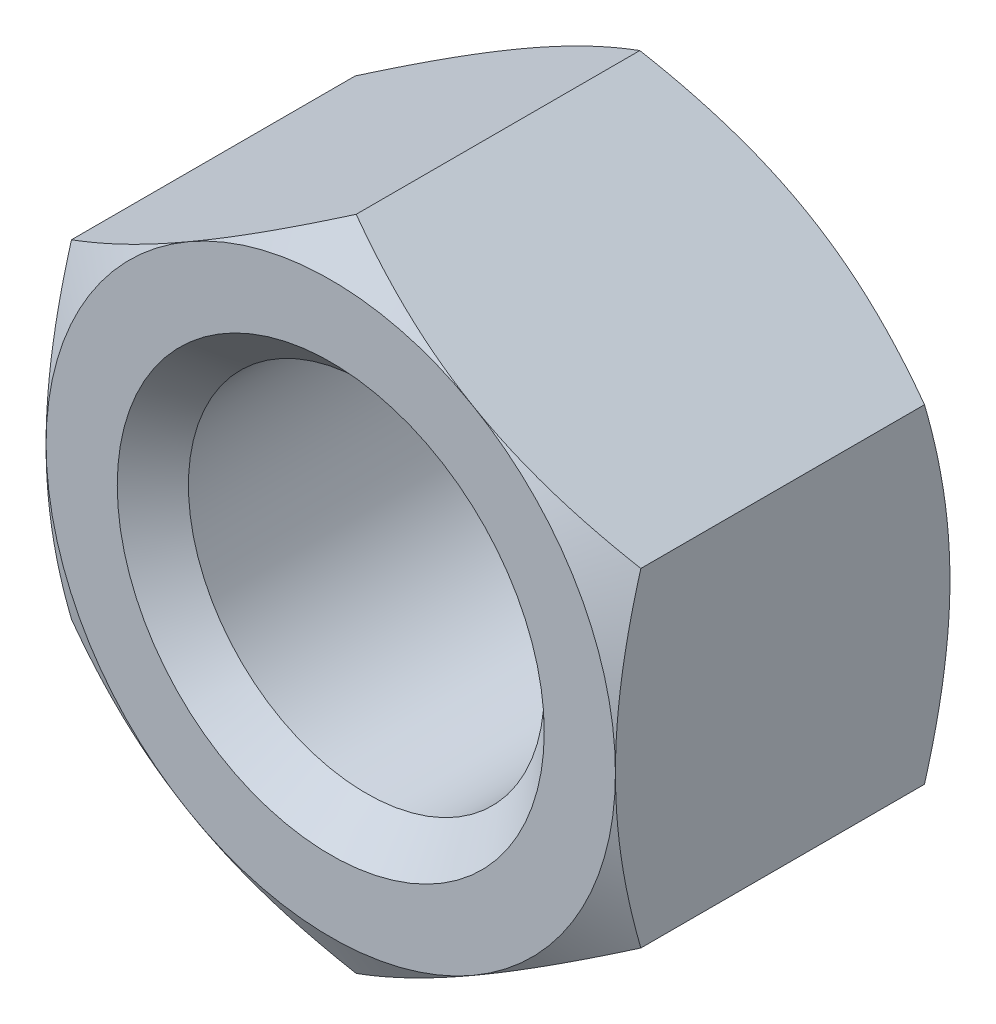
ISO-10303-21;
HEADER;
FILE_DESCRIPTION(('STEP AP214'),'2;1');
FILE_NAME('part.step','',(''),(''),'','','');
FILE_SCHEMA(('AUTOMOTIVE_DESIGN { 1 0 10303 214 1 1 1 1 }'));
ENDSEC;
DATA;
#1=APPLICATION_CONTEXT('core data for automotive mechanical design processes');
#2=APPLICATION_PROTOCOL_DEFINITION('international standard','automotive_design',2000,#1);
#3=PRODUCT_CONTEXT('',#1,'mechanical');
#4=PRODUCT('Part','Part','',(#3));
#5=PRODUCT_RELATED_PRODUCT_CATEGORY('part','',(#4));
#6=PRODUCT_DEFINITION_FORMATION('','',#4);
#7=PRODUCT_DEFINITION_CONTEXT('part definition',#1,'design');
#8=PRODUCT_DEFINITION('design','',#6,#7);
#9=PRODUCT_DEFINITION_SHAPE('','',#8);
#10=(LENGTH_UNIT() NAMED_UNIT(*) SI_UNIT(.MILLI.,.METRE.));
#11=(NAMED_UNIT(*) PLANE_ANGLE_UNIT() SI_UNIT($,.RADIAN.));
#12=(NAMED_UNIT(*) SI_UNIT($,.STERADIAN.) SOLID_ANGLE_UNIT());
#13=UNCERTAINTY_MEASURE_WITH_UNIT(LENGTH_MEASURE(1.E-05),#10,'distance_accuracy_value','');
#14=(GEOMETRIC_REPRESENTATION_CONTEXT(3) GLOBAL_UNCERTAINTY_ASSIGNED_CONTEXT((#13)) GLOBAL_UNIT_ASSIGNED_CONTEXT((#10,
#11,#12)) REPRESENTATION_CONTEXT('',''));
#15=CARTESIAN_POINT('',(0.,0.,0.));
#16=DIRECTION('',(0.,0.,1.));
#17=DIRECTION('',(1.,0.,0.));
#18=AXIS2_PLACEMENT_3D('',#15,#16,#17);
#19=CARTESIAN_POINT('',(0.,0.,4.7));
#20=DIRECTION('',(0.,0.,-1.));
#21=DIRECTION('',(-1.,0.,0.));
#22=AXIS2_PLACEMENT_3D('',#19,#20,#21);
#23=CONICAL_SURFACE('',#22,3.99999999999999,1.0471975511966);
#24=CARTESIAN_POINT('',(-0.0002,4.61891762357084,4.34266774092523));
#25=CARTESIAN_POINT('',(0.175579150323228,4.5174314838138,4.40128212635172));
#26=CARTESIAN_POINT('',(0.35287561632638,4.41506932144051,4.45458967853773));
#27=CARTESIAN_POINT('',(0.710538593175706,4.20857250547739,4.54763832925359));
#28=CARTESIAN_POINT('',(0.89091145897015,4.10443418285647,4.58734651097029));
#29=CARTESIAN_POINT('',(1.24942181870279,3.89744813015756,4.64915778471972));
#30=CARTESIAN_POINT('',(1.42750415293514,3.79463224655059,4.67167226847711));
#31=CARTESIAN_POINT('',(1.78450671716651,3.58851671999023,4.69854937685342));
#32=CARTESIAN_POINT('',(1.9634256496441,3.48521782616117,4.70293425857305));
#33=CARTESIAN_POINT('',(2.29774284219673,3.29219970504619,4.69380992706003));
#34=CARTESIAN_POINT('',(2.45319115998706,3.20245157692486,4.682541046012));
#35=CARTESIAN_POINT('',(2.76307505563505,3.02354002635497,4.6468260092018));
#36=CARTESIAN_POINT('',(2.91750956174413,2.93437722268072,4.62236765428846));
#37=CARTESIAN_POINT('',(3.22803232777458,2.75509682012354,4.56122393508071));
#38=CARTESIAN_POINT('',(3.3840812880631,2.6650019108942,4.52427939634514));
#39=CARTESIAN_POINT('',(3.69385183540384,2.48615580200001,4.44042992745197));
#40=CARTESIAN_POINT('',(3.84757739077378,2.39740231122585,4.39354469778726));
#41=CARTESIAN_POINT('',(4.0002,2.30928560670467,4.34266774092523));
#42=B_SPLINE_CURVE_WITH_KNOTS('',3,(#24,#25,#26,#27,#28,#29,#30,#31,#32,#33,#34,#35,#36,#37,#38,
#39,#40,#41),.UNSPECIFIED.,.F.,.F.,(4,2,2,2,2,2,2,2,4),(0.,0.634047835695965,1.26961969224543,
1.88946157213122,2.50854226669297,3.04757825393385,3.58711366126903,4.13861653143763,
4.68903648037743),.UNSPECIFIED.);
#43=CARTESIAN_POINT('',(0.,4.618802153517,4.34273441009184));
#44=VERTEX_POINT('',#43);
#45=CARTESIAN_POINT('',(2.,3.46410161513775,4.7));
#46=VERTEX_POINT('',#45);
#47=EDGE_CURVE('E293',#44,#46,#42,.T.);
#48=ORIENTED_EDGE('',*,*,#47,.F.);
#49=CARTESIAN_POINT('',(-4.0002,2.30928560670466,4.34266774092523));
#50=CARTESIAN_POINT('',(-3.82442084967677,2.4107717464617,4.40128212635172));
#51=CARTESIAN_POINT('',(-3.64712438367362,2.51313390883499,4.45458967853774));
#52=CARTESIAN_POINT('',(-3.28946140682429,2.71963072479811,4.54763832925359));
#53=CARTESIAN_POINT('',(-3.10908854102985,2.82376904741904,4.58734651097029));
#54=CARTESIAN_POINT('',(-2.75057818129721,3.03075510011795,4.64915778471972));
#55=CARTESIAN_POINT('',(-2.57249584706486,3.13357098372492,4.67167226847711));
#56=CARTESIAN_POINT('',(-2.21549328283349,3.33968651028528,4.69854937685342));
#57=CARTESIAN_POINT('',(-2.0365743503559,3.44298540411434,4.70293425857305));
#58=CARTESIAN_POINT('',(-1.70225715780327,3.63600352522932,4.69380992706003));
#59=CARTESIAN_POINT('',(-1.54680884001293,3.72575165335064,4.682541046012));
#60=CARTESIAN_POINT('',(-1.23692494436494,3.90466320392054,4.6468260092018));
#61=CARTESIAN_POINT('',(-1.08249043825587,3.99382600759478,4.62236765428847));
#62=CARTESIAN_POINT('',(-0.771967672225422,4.17310641015197,4.56122393508071));
#63=CARTESIAN_POINT('',(-0.615918711936897,4.26320131938131,4.52427939634514));
#64=CARTESIAN_POINT('',(-0.306148164596161,4.4420474282755,4.44042992745197));
#65=CARTESIAN_POINT('',(-0.152422609226221,4.53080091904966,4.39354469778726));
#66=CARTESIAN_POINT('',(0.000199999999999767,4.61891762357084,4.34266774092523));
#67=B_SPLINE_CURVE_WITH_KNOTS('',3,(#49,#50,#51,#52,#53,#54,#55,#56,#57,#58,#59,#60,#61,#62,#63,
#64,#65,#66),.UNSPECIFIED.,.F.,.F.,(4,2,2,2,2,2,2,2,4),(0.,0.634047835695965,1.26961969224543,
1.88946157213122,2.50854226669297,3.04757825393386,3.58711366126903,4.13861653143764,
4.68903648037743),.UNSPECIFIED.);
#68=CARTESIAN_POINT('',(-1.99999999999999,3.46410161513775,4.7));
#69=VERTEX_POINT('',#68);
#70=EDGE_CURVE('E187',#69,#44,#67,.T.);
#71=ORIENTED_EDGE('',*,*,#70,.F.);
#72=CARTESIAN_POINT('',(0.,0.,4.7));
#73=DIRECTION('',(0.,0.,1.));
#74=DIRECTION('',(1.,0.,0.));
#75=AXIS2_PLACEMENT_3D('',#72,#73,#74);
#76=CIRCLE('',#75,3.99999999999999);
#77=EDGE_CURVE('E296',#46,#69,#76,.T.);
#78=ORIENTED_EDGE('',*,*,#77,.F.);
#79=EDGE_LOOP('',(#48,#71,#78));
#80=FACE_BOUND('',#79,.T.);
#81=ADVANCED_FACE('F36',(#80),#23,.T.);
#82=CARTESIAN_POINT('',(4.,2.3094010767585,4.34273441009184));
#83=VERTEX_POINT('',#82);
#84=EDGE_CURVE('E230',#46,#83,#42,.T.);
#85=ORIENTED_EDGE('',*,*,#84,.F.);
#86=CARTESIAN_POINT('',(4.,0.,4.7));
#87=VERTEX_POINT('',#86);
#88=EDGE_CURVE('E152',#87,#46,#76,.T.);
#89=ORIENTED_EDGE('',*,*,#88,.F.);
#90=CARTESIAN_POINT('',(4.,-6.15545088747085,2.77110048854843));
#91=CARTESIAN_POINT('',(4.00000000000001,-5.98114186087783,2.85546231457587));
#92=CARTESIAN_POINT('',(4.,-5.80642751098609,2.93900126713936));
#93=CARTESIAN_POINT('',(4.,-5.45597243215449,3.10396963566688));
#94=CARTESIAN_POINT('',(4.,-5.28023154228886,3.18539870937307));
#95=CARTESIAN_POINT('',(4.,-4.9265789566514,3.34610351830733));
#96=CARTESIAN_POINT('',(4.,-4.74866061873608,3.42536468804252));
#97=CARTESIAN_POINT('',(4.,-4.39139197498405,3.5805787660156));
#98=CARTESIAN_POINT('',(4.,-4.21204173874208,3.65653183389324));
#99=CARTESIAN_POINT('',(4.,-3.84601982400982,3.80655169702362));
#100=CARTESIAN_POINT('',(4.,-3.65929378443006,3.8804865972198));
#101=CARTESIAN_POINT('',(4.,-3.2836394607088,4.02264382856622));
#102=CARTESIAN_POINT('',(4.,-3.09471092960005,4.09086551193142));
#103=CARTESIAN_POINT('',(4.,-2.71472052884562,4.21977015945126));
#104=CARTESIAN_POINT('',(4.,-2.52366403524861,4.28046880957509));
#105=CARTESIAN_POINT('',(4.,-2.13881115865353,4.39234809270445));
#106=CARTESIAN_POINT('',(4.,-1.94501567492137,4.44353177498659));
#107=CARTESIAN_POINT('',(4.,-1.55564287611942,4.53362352782791));
#108=CARTESIAN_POINT('',(4.,-1.36008084750245,4.57259643497073));
#109=CARTESIAN_POINT('',(4.,-0.966575851508147,4.63603138466969));
#110=CARTESIAN_POINT('',(4.,-0.768633095505255,4.6604947059061));
#111=CARTESIAN_POINT('',(4.,-0.373920044043125,4.69263778597106));
#112=CARTESIAN_POINT('',(4.,-0.177167442071596,4.7005294825183));
#113=CARTESIAN_POINT('',(4.,0.216304224954209,4.69941524775345));
#114=CARTESIAN_POINT('',(4.,0.413023289047261,4.69040889406233));
#115=CARTESIAN_POINT('',(4.,0.748437665028927,4.66127642659607));
#116=CARTESIAN_POINT('',(4.,0.887496552647106,4.64510883728164));
#117=CARTESIAN_POINT('',(4.,1.16455854560109,4.60536271634653));
#118=CARTESIAN_POINT('',(4.,1.30256149864476,4.58178313562572));
#119=CARTESIAN_POINT('',(4.,1.71482433029255,4.50116982292969));
#120=CARTESIAN_POINT('',(4.,1.98717590850952,4.43427744783848));
#121=CARTESIAN_POINT('',(4.,2.39434499914105,4.31876886880047));
#122=CARTESIAN_POINT('',(4.,2.53128526457542,4.27721333939712));
#123=CARTESIAN_POINT('',(4.,2.80383477839475,4.18990721083544));
#124=CARTESIAN_POINT('',(4.,2.9394440182531,4.14415658482255));
#125=CARTESIAN_POINT('',(4.,3.20937675661789,4.04918430191997));
#126=CARTESIAN_POINT('',(4.,3.34370069023235,3.99996387052887));
#127=CARTESIAN_POINT('',(4.,3.61124396151916,3.89861892121983));
#128=CARTESIAN_POINT('',(4.,3.74446330977272,3.84649443115788));
#129=CARTESIAN_POINT('',(4.,4.04870128818048,3.7242426028733));
#130=CARTESIAN_POINT('',(4.,4.21939338858742,3.65330436320314));
#131=CARTESIAN_POINT('',(4.,4.55940655095512,3.50820657634858));
#132=CARTESIAN_POINT('',(4.,4.72872754365851,3.43404686763082));
#133=CARTESIAN_POINT('',(4.,5.06623845002946,3.28312627237672));
#134=CARTESIAN_POINT('',(4.,5.23442816383921,3.20636493997549));
#135=CARTESIAN_POINT('',(4.,5.5698315542117,3.0507357665636));
#136=CARTESIAN_POINT('',(4.,5.73704521206639,2.97186788533723));
#137=CARTESIAN_POINT('',(4.,6.23775058722222,2.73255382234829));
#138=CARTESIAN_POINT('',(3.99999999999999,6.570010429471,2.56953141935787));
#139=CARTESIAN_POINT('',(3.99999999999999,7.23217091234607,2.23876568472744));
#140=CARTESIAN_POINT('',(3.99999999999999,7.56207147273066,2.07102219346682));
#141=CARTESIAN_POINT('',(3.99999999999999,8.19416831375056,1.74550981190927));
#142=CARTESIAN_POINT('',(3.99999999999999,8.49649716945776,1.58799788792128));
#143=CARTESIAN_POINT('',(3.99999999999999,9.10001953886559,1.27079530104014));
#144=CARTESIAN_POINT('',(3.99999999999999,9.4012130180079,1.11110457250164));
#145=CARTESIAN_POINT('',(3.99999999999999,10.0020291462337,0.790412315732012));
#146=CARTESIAN_POINT('',(3.99999999999999,10.3016538052005,0.629414548139541));
#147=CARTESIAN_POINT('',(3.99999999999999,10.9001707440637,0.306098465029867));
#148=CARTESIAN_POINT('',(3.99999999999999,11.1990630598532,0.143780215987023));
#149=CARTESIAN_POINT('',(3.99999999999999,11.4976828427579,-0.0190342814286935));
#150=B_SPLINE_CURVE_WITH_KNOTS('',3,(#90,#91,#92,#93,#94,#95,#96,#97,#98,#99,#100,#101,#102,
#103,#104,#105,#106,#107,#108,#109,#110,#111,#112,#113,#114,#115,#116,#117,#118,#119,#120,#121,
#122,#123,#124,#125,#126,#127,#128,#129,#130,#131,#132,#133,#134,#135,#136,#137,#138,#139,#140,
#141,#142,#143,#144,#145,#146,#147,#148,#149),.UNSPECIFIED.,.F.,.F.,(4,2,2,2,2,2,2,2,2,2,2,2,2,
2,2,2,2,2,2,2,2,2,2,2,2,2,2,2,2,4),(0.,0.580959133680623,1.16201192606087,1.74630973579809,
2.33057931764387,2.93299929486134,3.53548748440098,4.13669752633278,4.73771456413903,
5.33548401831462,5.93320078527869,6.52322548140264,7.11326492581866,7.5330470873157,
7.95288869194371,8.79305885268669,9.22234391725191,9.6516317300421,10.0807686752929,
10.5099015049321,11.0643958704508,11.6189180720164,12.1735357926845,12.7281641090279,
13.8383962827311,14.9486660387318,15.9713541002379,16.9940730427236,18.0144894037644,
19.0348547100405),.UNSPECIFIED.);
#151=EDGE_CURVE('E228',#83,#87,#150,.F.);
#152=ORIENTED_EDGE('',*,*,#151,.F.);
#153=EDGE_LOOP('',(#85,#89,#152));
#154=FACE_BOUND('',#153,.T.);
#155=ADVANCED_FACE('F284',(#154),#23,.T.);
#156=CARTESIAN_POINT('',(4.,-2.30940107675851,4.34273441009183));
#157=VERTEX_POINT('',#156);
#158=EDGE_CURVE('E223',#87,#157,#150,.F.);
#159=ORIENTED_EDGE('',*,*,#158,.F.);
#160=CARTESIAN_POINT('',(2.,-3.46410161513776,4.7));
#161=VERTEX_POINT('',#160);
#162=EDGE_CURVE('E299',#161,#87,#76,.T.);
#163=ORIENTED_EDGE('',*,*,#162,.F.);
#164=CARTESIAN_POINT('',(4.0002,-2.30928560670467,4.34266774092523));
#165=CARTESIAN_POINT('',(3.82442084967677,-2.41077174646171,4.40128212635171));
#166=CARTESIAN_POINT('',(3.64712438367362,-2.513133908835,4.45458967853773));
#167=CARTESIAN_POINT('',(3.28946140682429,-2.71963072479812,4.54763832925359));
#168=CARTESIAN_POINT('',(3.10908854102985,-2.82376904741905,4.58734651097029));
#169=CARTESIAN_POINT('',(2.75057818129721,-3.03075510011796,4.64915778471971));
#170=CARTESIAN_POINT('',(2.57249584706486,-3.13357098372492,4.6716722684771));
#171=CARTESIAN_POINT('',(2.21549328283349,-3.33968651028529,4.69854937685341));
#172=CARTESIAN_POINT('',(2.0365743503559,-3.44298540411435,4.70293425857305));
#173=CARTESIAN_POINT('',(1.70225715780327,-3.63600352522933,4.69380992706002));
#174=CARTESIAN_POINT('',(1.54680884001293,-3.72575165335065,4.682541046012));
#175=CARTESIAN_POINT('',(1.23692494436495,-3.90466320392055,4.6468260092018));
#176=CARTESIAN_POINT('',(1.08249043825587,-3.99382600759479,4.62236765428846));
#177=CARTESIAN_POINT('',(0.771967672225423,-4.17310641015198,4.5612239350807));
#178=CARTESIAN_POINT('',(0.615918711936899,-4.26320131938132,4.52427939634513));
#179=CARTESIAN_POINT('',(0.306148164596162,-4.44204742827551,4.44042992745197));
#180=CARTESIAN_POINT('',(0.152422609226222,-4.53080091904967,4.39354469778725));
#181=CARTESIAN_POINT('',(-0.000199999999998162,-4.61891762357085,4.34266774092523));
#182=B_SPLINE_CURVE_WITH_KNOTS('',3,(#164,#165,#166,#167,#168,#169,#170,#171,#172,#173,#174,
#175,#176,#177,#178,#179,#180,#181),.UNSPECIFIED.,.F.,.F.,(4,2,2,2,2,2,2,2,4),(0.,
0.634047835695966,1.26961969224543,1.88946157213122,2.50854226669297,3.04757825393386,
3.58711366126903,4.13861653143764,4.68903648037743),.UNSPECIFIED.);
#183=EDGE_CURVE('E229',#157,#161,#182,.T.);
#184=ORIENTED_EDGE('',*,*,#183,.F.);
#185=EDGE_LOOP('',(#159,#163,#184));
#186=FACE_BOUND('',#185,.T.);
#187=ADVANCED_FACE('F289',(#186),#23,.T.);
#188=CARTESIAN_POINT('',(0.,-4.61880215351701,4.34273441009183));
#189=VERTEX_POINT('',#188);
#190=EDGE_CURVE('E217',#161,#189,#182,.T.);
#191=ORIENTED_EDGE('',*,*,#190,.F.);
#192=CARTESIAN_POINT('',(-2.,-3.46410161513776,4.7));
#193=VERTEX_POINT('',#192);
#194=EDGE_CURVE('E301',#193,#161,#76,.T.);
#195=ORIENTED_EDGE('',*,*,#194,.F.);
#196=CARTESIAN_POINT('',(0.000200000000001616,-4.61891762357085,4.34266774092523));
#197=CARTESIAN_POINT('',(-0.175579150323227,-4.51743148381381,4.40128212635171));
#198=CARTESIAN_POINT('',(-0.35287561632638,-4.41506932144052,4.45458967853773));
#199=CARTESIAN_POINT('',(-0.710538593175706,-4.2085725054774,4.54763832925359));
#200=CARTESIAN_POINT('',(-0.890911458970151,-4.10443418285647,4.58734651097029));
#201=CARTESIAN_POINT('',(-1.24942181870279,-3.89744813015757,4.64915778471971));
#202=CARTESIAN_POINT('',(-1.42750415293514,-3.7946322465506,4.6716722684771));
#203=CARTESIAN_POINT('',(-1.78450671716651,-3.58851671999023,4.69854937685341));
#204=CARTESIAN_POINT('',(-1.9634256496441,-3.48521782616117,4.70293425857305));
#205=CARTESIAN_POINT('',(-2.29774284219673,-3.29219970504619,4.69380992706002));
#206=CARTESIAN_POINT('',(-2.45319115998707,-3.20245157692487,4.682541046012));
#207=CARTESIAN_POINT('',(-2.76307505563506,-3.02354002635497,4.6468260092018));
#208=CARTESIAN_POINT('',(-2.91750956174413,-2.93437722268073,4.62236765428846));
#209=CARTESIAN_POINT('',(-3.22803232777458,-2.75509682012355,4.56122393508071));
#210=CARTESIAN_POINT('',(-3.3840812880631,-2.6650019108942,4.52427939634513));
#211=CARTESIAN_POINT('',(-3.69385183540384,-2.48615580200001,4.44042992745197));
#212=CARTESIAN_POINT('',(-3.84757739077378,-2.39740231122585,4.39354469778726));
#213=CARTESIAN_POINT('',(-4.0002,-2.30928560670467,4.34266774092523));
#214=B_SPLINE_CURVE_WITH_KNOTS('',3,(#196,#197,#198,#199,#200,#201,#202,#203,#204,#205,#206,
#207,#208,#209,#210,#211,#212,#213),.UNSPECIFIED.,.F.,.F.,(4,2,2,2,2,2,2,2,4),(0.,
0.634047835695967,1.26961969224544,1.88946157213122,2.50854226669297,3.04757825393386,
3.58711366126904,4.13861653143764,4.68903648037743),.UNSPECIFIED.);
#215=EDGE_CURVE('E325',#189,#193,#214,.T.);
#216=ORIENTED_EDGE('',*,*,#215,.F.);
#217=EDGE_LOOP('',(#191,#195,#216));
#218=FACE_BOUND('',#217,.T.);
#219=ADVANCED_FACE('F329',(#218),#23,.T.);
#220=CARTESIAN_POINT('',(-4.,-2.30940107675851,4.34273441009183));
#221=VERTEX_POINT('',#220);
#222=EDGE_CURVE('E212',#193,#221,#214,.T.);
#223=ORIENTED_EDGE('',*,*,#222,.F.);
#224=CARTESIAN_POINT('',(-4.,0.,4.7));
#225=VERTEX_POINT('',#224);
#226=EDGE_CURVE('E316',#225,#193,#76,.T.);
#227=ORIENTED_EDGE('',*,*,#226,.F.);
#228=CARTESIAN_POINT('',(-4.,-6.15545088747085,2.77110048854844));
#229=CARTESIAN_POINT('',(-4.,-5.98114186087783,2.85546231457588));
#230=CARTESIAN_POINT('',(-4.,-5.80642751098609,2.93900126713936));
#231=CARTESIAN_POINT('',(-4.,-5.45597243215449,3.10396963566688));
#232=CARTESIAN_POINT('',(-4.,-5.28023154228886,3.18539870937307));
#233=CARTESIAN_POINT('',(-4.,-4.9265789566514,3.34610351830733));
#234=CARTESIAN_POINT('',(-4.,-4.74866061873608,3.42536468804253));
#235=CARTESIAN_POINT('',(-4.,-4.39139197498404,3.58057876601561));
#236=CARTESIAN_POINT('',(-4.,-4.21204173874208,3.65653183389324));
#237=CARTESIAN_POINT('',(-4.,-3.84601982400981,3.80655169702363));
#238=CARTESIAN_POINT('',(-4.,-3.65929378443006,3.8804865972198));
#239=CARTESIAN_POINT('',(-4.,-3.28363946070879,4.02264382856622));
#240=CARTESIAN_POINT('',(-4.,-3.09471092960005,4.09086551193142));
#241=CARTESIAN_POINT('',(-4.,-2.71472052884562,4.21977015945126));
#242=CARTESIAN_POINT('',(-4.,-2.52366403524861,4.28046880957509));
#243=CARTESIAN_POINT('',(-4.,-2.13881115865353,4.39234809270445));
#244=CARTESIAN_POINT('',(-4.,-1.94501567492137,4.44353177498659));
#245=CARTESIAN_POINT('',(-4.,-1.55564287611941,4.53362352782791));
#246=CARTESIAN_POINT('',(-4.,-1.36008084750244,4.57259643497073));
#247=CARTESIAN_POINT('',(-4.,-0.966575851508145,4.63603138466969));
#248=CARTESIAN_POINT('',(-4.,-0.768633095505253,4.6604947059061));
#249=CARTESIAN_POINT('',(-4.,-0.373920044043123,4.69263778597106));
#250=CARTESIAN_POINT('',(-4.,-0.177167442071594,4.7005294825183));
#251=CARTESIAN_POINT('',(-4.,0.216304224954209,4.69941524775345));
#252=CARTESIAN_POINT('',(-4.,0.413023289047261,4.69040889406233));
#253=CARTESIAN_POINT('',(-4.,0.748437665028928,4.66127642659607));
#254=CARTESIAN_POINT('',(-4.,0.887496552647107,4.64510883728164));
#255=CARTESIAN_POINT('',(-4.,1.16455854560109,4.60536271634653));
#256=CARTESIAN_POINT('',(-4.,1.30256149864477,4.58178313562572));
#257=CARTESIAN_POINT('',(-4.,1.71482433029255,4.50116982292968));
#258=CARTESIAN_POINT('',(-4.,1.98717590850953,4.43427744783848));
#259=CARTESIAN_POINT('',(-4.,2.39434499914105,4.31876886880046));
#260=CARTESIAN_POINT('',(-4.,2.53128526457542,4.27721333939712));
#261=CARTESIAN_POINT('',(-4.,2.80383477839475,4.18990721083544));
#262=CARTESIAN_POINT('',(-4.,2.93944401825311,4.14415658482255));
#263=CARTESIAN_POINT('',(-4.,3.20937675661789,4.04918430191997));
#264=CARTESIAN_POINT('',(-4.,3.34370069023235,3.99996387052887));
#265=CARTESIAN_POINT('',(-4.,3.61124396151917,3.89861892121982));
#266=CARTESIAN_POINT('',(-4.,3.74446330977272,3.84649443115787));
#267=CARTESIAN_POINT('',(-4.,4.04870128818048,3.7242426028733));
#268=CARTESIAN_POINT('',(-4.,4.21939338858743,3.65330436320314));
#269=CARTESIAN_POINT('',(-4.,4.55940655095512,3.50820657634858));
#270=CARTESIAN_POINT('',(-4.,4.72872754365851,3.43404686763082));
#271=CARTESIAN_POINT('',(-4.,5.06623845002947,3.28312627237671));
#272=CARTESIAN_POINT('',(-4.,5.23442816383922,3.20636493997548));
#273=CARTESIAN_POINT('',(-4.,5.56983155421171,3.05073576656359));
#274=CARTESIAN_POINT('',(-4.,5.73704521206639,2.97186788533723));
#275=CARTESIAN_POINT('',(-4.,6.23775058722222,2.73255382234828));
#276=CARTESIAN_POINT('',(-4.,6.570010429471,2.56953141935786));
#277=CARTESIAN_POINT('',(-4.,7.23217091234607,2.23876568472744));
#278=CARTESIAN_POINT('',(-4.,7.56207147273066,2.07102219346681));
#279=CARTESIAN_POINT('',(-4.,8.19416831375056,1.74550981190926));
#280=CARTESIAN_POINT('',(-4.,8.49649716945776,1.58799788792127));
#281=CARTESIAN_POINT('',(-4.,9.10001953886559,1.27079530104014));
#282=CARTESIAN_POINT('',(-4.,9.4012130180079,1.11110457250164));
#283=CARTESIAN_POINT('',(-4.,10.0020291462337,0.79041231573201));
#284=CARTESIAN_POINT('',(-4.,10.3016538052005,0.629414548139539));
#285=CARTESIAN_POINT('',(-4.,10.9001707440637,0.306098465029865));
#286=CARTESIAN_POINT('',(-4.,11.1990630598532,0.143780215987021));
#287=CARTESIAN_POINT('',(-4.,11.4976828427579,-0.0190342814286965));
#288=B_SPLINE_CURVE_WITH_KNOTS('',3,(#228,#229,#230,#231,#232,#233,#234,#235,#236,#237,#238,
#239,#240,#241,#242,#243,#244,#245,#246,#247,#248,#249,#250,#251,#252,#253,#254,#255,#256,#257,
#258,#259,#260,#261,#262,#263,#264,#265,#266,#267,#268,#269,#270,#271,#272,#273,#274,#275,#276,
#277,#278,#279,#280,#281,#282,#283,#284,#285,#286,#287),.UNSPECIFIED.,.F.,.F.,(4,2,2,2,2,2,2,2,
2,2,2,2,2,2,2,2,2,2,2,2,2,2,2,2,2,2,2,2,2,4),(0.,0.580959133680623,1.16201192606087,
1.74630973579809,2.33057931764387,2.93299929486134,3.53548748440098,4.13669752633278,
4.73771456413903,5.33548401831462,5.93320078527869,6.52322548140263,7.11326492581866,
7.5330470873157,7.95288869194371,8.79305885268669,9.22234391725191,9.6516317300421,
10.0807686752929,10.5099015049321,11.0643958704508,11.6189180720164,12.1735357926845,
12.7281641090279,13.8383962827311,14.9486660387318,15.9713541002379,16.9940730427236,
18.0144894037644,19.0348547100405),.UNSPECIFIED.);
#289=EDGE_CURVE('E321',#221,#225,#288,.T.);
#290=ORIENTED_EDGE('',*,*,#289,.F.);
#291=EDGE_LOOP('',(#223,#227,#290));
#292=FACE_BOUND('',#291,.T.);
#293=ADVANCED_FACE('F204',(#292),#23,.T.);
#294=CARTESIAN_POINT('',(0.,0.,0.577350269189625));
#295=DIRECTION('',(0.,0.,1.));
#296=DIRECTION('',(1.,0.,0.));
#297=AXIS2_PLACEMENT_3D('',#294,#295,#296);
#298=CONICAL_SURFACE('',#297,5.,1.0471975511966);
#299=CARTESIAN_POINT('',(-0.000199999999998363,-4.61891762357085,0.357332259074774));
#300=CARTESIAN_POINT('',(0.17557915032323,-4.51743148381381,0.29871787364829));
#301=CARTESIAN_POINT('',(0.352875616326383,-4.41506932144052,0.24541032146227));
#302=CARTESIAN_POINT('',(0.710538593175709,-4.2085725054774,0.152361670746411));
#303=CARTESIAN_POINT('',(0.890911458970154,-4.10443418285647,0.112653489029712));
#304=CARTESIAN_POINT('',(1.24942181870279,-3.89744813015757,0.0508422152802867));
#305=CARTESIAN_POINT('',(1.42750415293515,-3.7946322465506,0.0283277315228968));
#306=CARTESIAN_POINT('',(1.78450671716651,-3.58851671999023,0.00145062314658984));
#307=CARTESIAN_POINT('',(1.96342564964411,-3.48521782616117,-0.00293425857304897));
#308=CARTESIAN_POINT('',(2.29774284219674,-3.29219970504619,0.00619007293997787));
#309=CARTESIAN_POINT('',(2.45319115998707,-3.20245157692487,0.0174589539880018));
#310=CARTESIAN_POINT('',(2.76307505563506,-3.02354002635497,0.0531739907982004));
#311=CARTESIAN_POINT('',(2.91750956174413,-2.93437722268073,0.07763234571154));
#312=CARTESIAN_POINT('',(3.22803232777458,-2.75509682012355,0.138776064919296));
#313=CARTESIAN_POINT('',(3.3840812880631,-2.66500191089421,0.17572060365487));
#314=CARTESIAN_POINT('',(3.69385183540384,-2.48615580200001,0.259570072548032));
#315=CARTESIAN_POINT('',(3.84757739077378,-2.39740231122585,0.306455302212745));
#316=CARTESIAN_POINT('',(4.0002,-2.30928560670467,0.357332259074771));
#317=B_SPLINE_CURVE_WITH_KNOTS('',3,(#299,#300,#301,#302,#303,#304,#305,#306,#307,#308,#309,
#310,#311,#312,#313,#314,#315,#316),.UNSPECIFIED.,.F.,.F.,(4,2,2,2,2,2,2,2,4),(0.,
0.634047835695967,1.26961969224544,1.88946157213122,2.50854226669297,3.04757825393386,
3.58711366126904,4.13861653143764,4.68903648037743),.UNSPECIFIED.);
#318=CARTESIAN_POINT('',(0.,-4.61880215351701,0.35726558990817));
#319=VERTEX_POINT('',#318);
#320=CARTESIAN_POINT('',(2.,-3.46410161513776,0.));
#321=VERTEX_POINT('',#320);
#322=EDGE_CURVE('E260',#319,#321,#317,.T.);
#323=ORIENTED_EDGE('',*,*,#322,.F.);
#324=CARTESIAN_POINT('',(-4.0002,-2.30928560670467,0.35733225907477));
#325=CARTESIAN_POINT('',(-3.82442084967677,-2.41077174646171,0.298717873648286));
#326=CARTESIAN_POINT('',(-3.64712438367362,-2.513133908835,0.245410321462267));
#327=CARTESIAN_POINT('',(-3.28946140682429,-2.71963072479812,0.152361670746408));
#328=CARTESIAN_POINT('',(-3.10908854102985,-2.82376904741905,0.112653489029709));
#329=CARTESIAN_POINT('',(-2.75057818129721,-3.03075510011796,0.0508422152802847));
#330=CARTESIAN_POINT('',(-2.57249584706486,-3.13357098372492,0.0283277315228948));
#331=CARTESIAN_POINT('',(-2.21549328283349,-3.33968651028529,0.00145062314658824));
#332=CARTESIAN_POINT('',(-2.0365743503559,-3.44298540411435,-0.00293425857305029));
#333=CARTESIAN_POINT('',(-1.70225715780327,-3.63600352522933,0.00619007293997719));
#334=CARTESIAN_POINT('',(-1.54680884001293,-3.72575165335065,0.0174589539880015));
#335=CARTESIAN_POINT('',(-1.23692494436494,-3.90466320392055,0.0531739907982006));
#336=CARTESIAN_POINT('',(-1.08249043825587,-3.99382600759479,0.0776323457115404));
#337=CARTESIAN_POINT('',(-0.771967672225421,-4.17310641015198,0.138776064919296));
#338=CARTESIAN_POINT('',(-0.615918711936896,-4.26320131938132,0.17572060365487));
#339=CARTESIAN_POINT('',(-0.306148164596159,-4.44204742827551,0.259570072548034));
#340=CARTESIAN_POINT('',(-0.152422609226219,-4.53080091904967,0.306455302212747));
#341=CARTESIAN_POINT('',(0.000200000000001244,-4.61891762357085,0.357332259074774));
#342=B_SPLINE_CURVE_WITH_KNOTS('',3,(#324,#325,#326,#327,#328,#329,#330,#331,#332,#333,#334,
#335,#336,#337,#338,#339,#340,#341),.UNSPECIFIED.,.F.,.F.,(4,2,2,2,2,2,2,2,4),(0.,
0.634047835695966,1.26961969224543,1.88946157213122,2.50854226669297,3.04757825393386,
3.58711366126903,4.13861653143764,4.68903648037743),.UNSPECIFIED.);
#343=CARTESIAN_POINT('',(-2.,-3.46410161513776,0.));
#344=VERTEX_POINT('',#343);
#345=EDGE_CURVE('E261',#344,#319,#342,.T.);
#346=ORIENTED_EDGE('',*,*,#345,.F.);
#347=CARTESIAN_POINT('',(0.,0.,0.));
#348=DIRECTION('',(0.,0.,1.));
#349=DIRECTION('',(1.,0.,0.));
#350=AXIS2_PLACEMENT_3D('',#347,#348,#349);
#351=CIRCLE('',#350,3.99999999999999);
#352=EDGE_CURVE('E163',#321,#344,#351,.F.);
#353=ORIENTED_EDGE('',*,*,#352,.F.);
#354=EDGE_LOOP('',(#323,#346,#353));
#355=FACE_BOUND('',#354,.T.);
#356=ADVANCED_FACE('F360',(#355),#298,.T.);
#357=CARTESIAN_POINT('',(4.,-2.30940107675851,0.357265589908168));
#358=VERTEX_POINT('',#357);
#359=EDGE_CURVE('E255',#321,#358,#317,.T.);
#360=ORIENTED_EDGE('',*,*,#359,.F.);
#361=CARTESIAN_POINT('',(4.,0.,0.));
#362=VERTEX_POINT('',#361);
#363=EDGE_CURVE('E154',#362,#321,#351,.F.);
#364=ORIENTED_EDGE('',*,*,#363,.F.);
#365=CARTESIAN_POINT('',(4.,-6.15545088747086,1.92889951145157));
#366=CARTESIAN_POINT('',(4.00000000000001,-5.98114186087783,1.84453768542413));
#367=CARTESIAN_POINT('',(4.,-5.80642751098609,1.76099873286064));
#368=CARTESIAN_POINT('',(4.,-5.4559724321545,1.59603036433313));
#369=CARTESIAN_POINT('',(4.,-5.28023154228886,1.51460129062693));
#370=CARTESIAN_POINT('',(4.,-4.9265789566514,1.35389648169267));
#371=CARTESIAN_POINT('',(4.,-4.74866061873608,1.27463531195748));
#372=CARTESIAN_POINT('',(4.,-4.39139197498405,1.1194212339844));
#373=CARTESIAN_POINT('',(4.,-4.21204173874208,1.04346816610676));
#374=CARTESIAN_POINT('',(4.,-3.84601982400982,0.893448302976376));
#375=CARTESIAN_POINT('',(4.,-3.65929378443006,0.8195134027802));
#376=CARTESIAN_POINT('',(4.,-3.2836394607088,0.67735617143378));
#377=CARTESIAN_POINT('',(4.,-3.09471092960005,0.60913448806858));
#378=CARTESIAN_POINT('',(4.,-2.71472052884562,0.480229840548743));
#379=CARTESIAN_POINT('',(4.,-2.52366403524861,0.419531190424914));
#380=CARTESIAN_POINT('',(4.,-2.13881115865353,0.307651907295555));
#381=CARTESIAN_POINT('',(4.,-1.94501567492137,0.256468225013411));
#382=CARTESIAN_POINT('',(4.,-1.55564287611942,0.166376472172095));
#383=CARTESIAN_POINT('',(4.,-1.36008084750245,0.127403565029272));
#384=CARTESIAN_POINT('',(4.,-0.966575851508146,0.0639686153303124));
#385=CARTESIAN_POINT('',(4.,-0.768633095505255,0.0395052940939049));
#386=CARTESIAN_POINT('',(4.,-0.373920044043125,0.00736221402894011));
#387=CARTESIAN_POINT('',(4.,-0.177167442071596,-0.000529482518296474));
#388=CARTESIAN_POINT('',(4.,0.216304224954208,0.000584752246553485));
#389=CARTESIAN_POINT('',(4.,0.413023289047261,0.00959110593767275));
#390=CARTESIAN_POINT('',(4.,0.748437665028928,0.0387235734039299));
#391=CARTESIAN_POINT('',(4.,0.887496552647107,0.0548911627183628));
#392=CARTESIAN_POINT('',(4.,1.1645585456011,0.0946372836534685));
#393=CARTESIAN_POINT('',(4.,1.30256149864477,0.118216864374282));
#394=CARTESIAN_POINT('',(4.,1.71482433029255,0.198830177070315));
#395=CARTESIAN_POINT('',(4.,1.98717590850952,0.265722552161516));
#396=CARTESIAN_POINT('',(4.,2.39434499914105,0.381231131199534));
#397=CARTESIAN_POINT('',(4.,2.53128526457542,0.42278666060288));
#398=CARTESIAN_POINT('',(4.,2.80383477839475,0.510092789164556));
#399=CARTESIAN_POINT('',(4.,2.93944401825311,0.555843415177453));
#400=CARTESIAN_POINT('',(4.,3.20937675661789,0.65081569808003));
#401=CARTESIAN_POINT('',(4.,3.34370069023235,0.700036129471133));
#402=CARTESIAN_POINT('',(4.,3.61124396151916,0.801381078780175));
#403=CARTESIAN_POINT('',(4.,3.74446330977272,0.853505568842124));
#404=CARTESIAN_POINT('',(4.,4.04870128818048,0.975757397126699));
#405=CARTESIAN_POINT('',(4.,4.21939338858743,1.04669563679686));
#406=CARTESIAN_POINT('',(4.,4.55940655095512,1.19179342365142));
#407=CARTESIAN_POINT('',(4.,4.72872754365851,1.26595313236918));
#408=CARTESIAN_POINT('',(4.,5.06623845002947,1.41687372762329));
#409=CARTESIAN_POINT('',(4.,5.23442816383922,1.49363506002452));
#410=CARTESIAN_POINT('',(4.,5.56983155421171,1.64926423343641));
#411=CARTESIAN_POINT('',(4.,5.73704521206639,1.72813211466277));
#412=CARTESIAN_POINT('',(4.,6.23775058722223,1.96744617765172));
#413=CARTESIAN_POINT('',(3.99999999999999,6.57001042947101,2.13046858064214));
#414=CARTESIAN_POINT('',(3.99999999999999,7.23217091234608,2.46123431527256));
#415=CARTESIAN_POINT('',(3.99999999999999,7.56207147273067,2.62897780653319));
#416=CARTESIAN_POINT('',(3.99999999999999,8.19416831375057,2.95449018809074));
#417=CARTESIAN_POINT('',(3.99999999999999,8.49649716945776,3.11200211207873));
#418=CARTESIAN_POINT('',(3.99999999999999,9.10001953886559,3.42920469895986));
#419=CARTESIAN_POINT('',(3.99999999999999,9.4012130180079,3.58889542749837));
#420=CARTESIAN_POINT('',(3.99999999999999,10.0020291462337,3.90958768426799));
#421=CARTESIAN_POINT('',(3.99999999999999,10.3016538052005,4.07058545186046));
#422=CARTESIAN_POINT('',(3.99999999999999,10.9001707440637,4.39390153497014));
#423=CARTESIAN_POINT('',(3.99999999999999,11.1990630598532,4.55621978401298));
#424=CARTESIAN_POINT('',(3.99999999999999,11.4976828427579,4.7190342814287));
#425=B_SPLINE_CURVE_WITH_KNOTS('',3,(#365,#366,#367,#368,#369,#370,#371,#372,#373,#374,#375,
#376,#377,#378,#379,#380,#381,#382,#383,#384,#385,#386,#387,#388,#389,#390,#391,#392,#393,#394,
#395,#396,#397,#398,#399,#400,#401,#402,#403,#404,#405,#406,#407,#408,#409,#410,#411,#412,#413,
#414,#415,#416,#417,#418,#419,#420,#421,#422,#423,#424),.UNSPECIFIED.,.F.,.F.,(4,2,2,2,2,2,2,2,
2,2,2,2,2,2,2,2,2,2,2,2,2,2,2,2,2,2,2,2,2,4),(0.,0.580959133680623,1.16201192606087,
1.74630973579809,2.33057931764387,2.93299929486134,3.53548748440098,4.13669752633279,
4.73771456413903,5.33548401831462,5.93320078527869,6.52322548140264,7.11326492581866,
7.5330470873157,7.95288869194372,8.79305885268669,9.22234391725192,9.65163173004211,
10.0807686752929,10.5099015049321,11.0643958704508,11.6189180720164,12.1735357926845,
12.7281641090279,13.8383962827311,14.9486660387319,15.9713541002379,16.9940730427236,
18.0144894037644,19.0348547100405),.UNSPECIFIED.);
#426=EDGE_CURVE('E250',#358,#362,#425,.T.);
#427=ORIENTED_EDGE('',*,*,#426,.F.);
#428=EDGE_LOOP('',(#360,#364,#427));
#429=FACE_BOUND('',#428,.T.);
#430=ADVANCED_FACE('F355',(#429),#298,.T.);
#431=CARTESIAN_POINT('',(4.,2.3094010767585,0.357265589908164));
#432=VERTEX_POINT('',#431);
#433=EDGE_CURVE('E148',#362,#432,#425,.T.);
#434=ORIENTED_EDGE('',*,*,#433,.F.);
#435=CARTESIAN_POINT('',(2.,3.46410161513775,0.));
#436=VERTEX_POINT('',#435);
#437=EDGE_CURVE('E146',#436,#362,#351,.F.);
#438=ORIENTED_EDGE('',*,*,#437,.F.);
#439=CARTESIAN_POINT('',(4.0002,2.30928560670467,0.357332259074768));
#440=CARTESIAN_POINT('',(3.82442084967677,2.4107717464617,0.298717873648284));
#441=CARTESIAN_POINT('',(3.64712438367362,2.51313390883499,0.245410321462264));
#442=CARTESIAN_POINT('',(3.28946140682429,2.71963072479811,0.152361670746406));
#443=CARTESIAN_POINT('',(3.10908854102985,2.82376904741904,0.112653489029706));
#444=CARTESIAN_POINT('',(2.75057818129721,3.03075510011795,0.0508422152802814));
#445=CARTESIAN_POINT('',(2.57249584706486,3.13357098372492,0.0283277315228914));
#446=CARTESIAN_POINT('',(2.21549328283349,3.33968651028528,0.00145062314658457));
#447=CARTESIAN_POINT('',(2.0365743503559,3.44298540411434,-0.00293425857305395));
#448=CARTESIAN_POINT('',(1.70225715780327,3.63600352522932,0.00619007293997288));
#449=CARTESIAN_POINT('',(1.54680884001293,3.72575165335064,0.0174589539879966));
#450=CARTESIAN_POINT('',(1.23692494436494,3.90466320392054,0.0531739907981952));
#451=CARTESIAN_POINT('',(1.08249043825587,3.99382600759478,0.077632345711535));
#452=CARTESIAN_POINT('',(0.771967672225422,4.17310641015197,0.138776064919291));
#453=CARTESIAN_POINT('',(0.615918711936898,4.26320131938131,0.175720603654865));
#454=CARTESIAN_POINT('',(0.30614816459616,4.4420474282755,0.259570072548028));
#455=CARTESIAN_POINT('',(0.152422609226221,4.53080091904966,0.306455302212741));
#456=CARTESIAN_POINT('',(-0.000199999999999991,4.61891762357084,0.357332259074768));
#457=B_SPLINE_CURVE_WITH_KNOTS('',3,(#439,#440,#441,#442,#443,#444,#445,#446,#447,#448,#449,
#450,#451,#452,#453,#454,#455,#456),.UNSPECIFIED.,.F.,.F.,(4,2,2,2,2,2,2,2,4),(0.,
0.634047835695966,1.26961969224543,1.88946157213122,2.50854226669297,3.04757825393386,
3.58711366126903,4.13861653143763,4.68903648037743),.UNSPECIFIED.);
#458=EDGE_CURVE('E126',#432,#436,#457,.T.);
#459=ORIENTED_EDGE('',*,*,#458,.F.);
#460=EDGE_LOOP('',(#434,#438,#459));
#461=FACE_BOUND('',#460,.T.);
#462=ADVANCED_FACE('F147',(#461),#298,.T.);
#463=CARTESIAN_POINT('',(-4.,-2.30940107675851,0.357265589908166));
#464=VERTEX_POINT('',#463);
#465=EDGE_CURVE('E251',#464,#344,#342,.T.);
#466=ORIENTED_EDGE('',*,*,#465,.F.);
#467=CARTESIAN_POINT('',(-4.,-6.15545088747085,1.92889951145156));
#468=CARTESIAN_POINT('',(-4.,-5.98114186087783,1.84453768542412));
#469=CARTESIAN_POINT('',(-4.,-5.80642751098609,1.76099873286064));
#470=CARTESIAN_POINT('',(-4.,-5.45597243215449,1.59603036433312));
#471=CARTESIAN_POINT('',(-4.,-5.28023154228886,1.51460129062693));
#472=CARTESIAN_POINT('',(-4.,-4.9265789566514,1.35389648169267));
#473=CARTESIAN_POINT('',(-4.,-4.74866061873608,1.27463531195747));
#474=CARTESIAN_POINT('',(-4.,-4.39139197498404,1.11942123398439));
#475=CARTESIAN_POINT('',(-4.,-4.21204173874208,1.04346816610676));
#476=CARTESIAN_POINT('',(-4.,-3.84601982400981,0.893448302976372));
#477=CARTESIAN_POINT('',(-4.,-3.65929378443006,0.819513402780196));
#478=CARTESIAN_POINT('',(-4.,-3.28363946070879,0.677356171433776));
#479=CARTESIAN_POINT('',(-4.,-3.09471092960005,0.609134488068577));
#480=CARTESIAN_POINT('',(-4.,-2.71472052884562,0.480229840548741));
#481=CARTESIAN_POINT('',(-4.,-2.52366403524861,0.419531190424912));
#482=CARTESIAN_POINT('',(-4.,-2.13881115865353,0.307651907295553));
#483=CARTESIAN_POINT('',(-4.,-1.94501567492137,0.256468225013409));
#484=CARTESIAN_POINT('',(-4.,-1.55564287611941,0.166376472172093));
#485=CARTESIAN_POINT('',(-4.,-1.36008084750244,0.12740356502927));
#486=CARTESIAN_POINT('',(-4.,-0.966575851508146,0.0639686153303113));
#487=CARTESIAN_POINT('',(-4.,-0.768633095505254,0.0395052940939039));
#488=CARTESIAN_POINT('',(-4.,-0.373920044043125,0.00736221402893928));
#489=CARTESIAN_POINT('',(-4.,-0.177167442071596,-0.000529482518296988));
#490=CARTESIAN_POINT('',(-4.,0.216304224954208,0.000584752246553357));
#491=CARTESIAN_POINT('',(-4.,0.41302328904726,0.00959110593767267));
#492=CARTESIAN_POINT('',(-4.,0.748437665028927,0.0387235734039299));
#493=CARTESIAN_POINT('',(-4.,0.887496552647106,0.0548911627183629));
#494=CARTESIAN_POINT('',(-4.,1.16455854560109,0.0946372836534687));
#495=CARTESIAN_POINT('',(-4.,1.30256149864477,0.118216864374282));
#496=CARTESIAN_POINT('',(-4.,1.71482433029255,0.198830177070316));
#497=CARTESIAN_POINT('',(-4.,1.98717590850953,0.265722552161517));
#498=CARTESIAN_POINT('',(-4.,2.39434499914105,0.381231131199536));
#499=CARTESIAN_POINT('',(-4.,2.53128526457542,0.422786660602881));
#500=CARTESIAN_POINT('',(-4.,2.80383477839475,0.510092789164557));
#501=CARTESIAN_POINT('',(-4.,2.93944401825311,0.555843415177455));
#502=CARTESIAN_POINT('',(-4.,3.20937675661789,0.650815698080032));
#503=CARTESIAN_POINT('',(-4.,3.34370069023235,0.700036129471135));
#504=CARTESIAN_POINT('',(-4.,3.61124396151917,0.801381078780177));
#505=CARTESIAN_POINT('',(-4.,3.74446330977272,0.853505568842125));
#506=CARTESIAN_POINT('',(-4.,4.04870128818048,0.9757573971267));
#507=CARTESIAN_POINT('',(-4.,4.21939338858743,1.04669563679686));
#508=CARTESIAN_POINT('',(-4.,4.55940655095512,1.19179342365142));
#509=CARTESIAN_POINT('',(-4.,4.72872754365851,1.26595313236918));
#510=CARTESIAN_POINT('',(-4.,5.06623845002947,1.41687372762329));
#511=CARTESIAN_POINT('',(-4.,5.23442816383922,1.49363506002452));
#512=CARTESIAN_POINT('',(-4.,5.56983155421171,1.64926423343641));
#513=CARTESIAN_POINT('',(-4.,5.73704521206639,1.72813211466277));
#514=CARTESIAN_POINT('',(-4.,6.23775058722222,1.96744617765172));
#515=CARTESIAN_POINT('',(-4.,6.570010429471,2.13046858064214));
#516=CARTESIAN_POINT('',(-4.,7.23217091234607,2.46123431527256));
#517=CARTESIAN_POINT('',(-4.,7.56207147273066,2.62897780653319));
#518=CARTESIAN_POINT('',(-4.,8.19416831375056,2.95449018809074));
#519=CARTESIAN_POINT('',(-4.,8.49649716945776,3.11200211207873));
#520=CARTESIAN_POINT('',(-4.,9.10001953886559,3.42920469895987));
#521=CARTESIAN_POINT('',(-4.,9.4012130180079,3.58889542749837));
#522=CARTESIAN_POINT('',(-4.,10.0020291462337,3.90958768426799));
#523=CARTESIAN_POINT('',(-4.,10.3016538052005,4.07058545186046));
#524=CARTESIAN_POINT('',(-4.,10.9001707440637,4.39390153497014));
#525=CARTESIAN_POINT('',(-4.,11.1990630598532,4.55621978401298));
#526=CARTESIAN_POINT('',(-4.,11.4976828427579,4.7190342814287));
#527=B_SPLINE_CURVE_WITH_KNOTS('',3,(#467,#468,#469,#470,#471,#472,#473,#474,#475,#476,#477,
#478,#479,#480,#481,#482,#483,#484,#485,#486,#487,#488,#489,#490,#491,#492,#493,#494,#495,#496,
#497,#498,#499,#500,#501,#502,#503,#504,#505,#506,#507,#508,#509,#510,#511,#512,#513,#514,#515,
#516,#517,#518,#519,#520,#521,#522,#523,#524,#525,#526),.UNSPECIFIED.,.F.,.F.,(4,2,2,2,2,2,2,2,
2,2,2,2,2,2,2,2,2,2,2,2,2,2,2,2,2,2,2,2,2,4),(0.,0.580959133680623,1.16201192606087,
1.74630973579809,2.33057931764387,2.93299929486134,3.53548748440098,4.13669752633278,
4.73771456413903,5.33548401831462,5.93320078527869,6.52322548140263,7.11326492581865,
7.5330470873157,7.95288869194371,8.79305885268669,9.22234391725191,9.6516317300421,
10.0807686752929,10.5099015049321,11.0643958704508,11.6189180720164,12.1735357926845,
12.7281641090279,13.8383962827311,14.9486660387318,15.9713541002379,16.9940730427236,
18.0144894037644,19.0348547100405),.UNSPECIFIED.);
#528=CARTESIAN_POINT('',(-4.,0.,0.));
#529=VERTEX_POINT('',#528);
#530=EDGE_CURVE('E136',#529,#464,#527,.F.);
#531=ORIENTED_EDGE('',*,*,#530,.F.);
#532=EDGE_CURVE('E159',#344,#529,#351,.F.);
#533=ORIENTED_EDGE('',*,*,#532,.F.);
#534=EDGE_LOOP('',(#466,#531,#533));
#535=FACE_BOUND('',#534,.T.);
#536=ADVANCED_FACE('F362',(#535),#298,.T.);
#537=CARTESIAN_POINT('',(0.,4.618802153517,0.357265589908163));
#538=VERTEX_POINT('',#537);
#539=EDGE_CURVE('E130',#436,#538,#457,.T.);
#540=ORIENTED_EDGE('',*,*,#539,.F.);
#541=CARTESIAN_POINT('',(-1.99999999999999,3.46410161513775,0.));
#542=VERTEX_POINT('',#541);
#543=EDGE_CURVE('E142',#542,#436,#351,.F.);
#544=ORIENTED_EDGE('',*,*,#543,.F.);
#545=CARTESIAN_POINT('',(0.0002,4.61891762357084,0.357332259074767));
#546=CARTESIAN_POINT('',(-0.175579150323228,4.5174314838138,0.298717873648284));
#547=CARTESIAN_POINT('',(-0.352875616326381,4.41506932144051,0.245410321462264));
#548=CARTESIAN_POINT('',(-0.710538593175706,4.20857250547739,0.152361670746405));
#549=CARTESIAN_POINT('',(-0.890911458970151,4.10443418285647,0.112653489029706));
#550=CARTESIAN_POINT('',(-1.24942181870279,3.89744813015756,0.0508422152802812));
#551=CARTESIAN_POINT('',(-1.42750415293514,3.79463224655059,0.0283277315228913));
#552=CARTESIAN_POINT('',(-1.78450671716651,3.58851671999023,0.00145062314658447));
#553=CARTESIAN_POINT('',(-1.9634256496441,3.48521782616117,-0.00293425857305418));
#554=CARTESIAN_POINT('',(-2.29774284219673,3.29219970504619,0.00619007293997295));
#555=CARTESIAN_POINT('',(-2.45319115998706,3.20245157692486,0.0174589539879971));
#556=CARTESIAN_POINT('',(-2.76307505563505,3.02354002635497,0.0531739907981957));
#557=CARTESIAN_POINT('',(-2.91750956174413,2.93437722268072,0.0776323457115352));
#558=CARTESIAN_POINT('',(-3.22803232777458,2.75509682012354,0.138776064919291));
#559=CARTESIAN_POINT('',(-3.3840812880631,2.6650019108942,0.175720603654866));
#560=CARTESIAN_POINT('',(-3.69385183540384,2.48615580200001,0.25957007254803));
#561=CARTESIAN_POINT('',(-3.84757739077378,2.39740231122585,0.306455302212742));
#562=CARTESIAN_POINT('',(-4.0002,2.30928560670466,0.357332259074769));
#563=B_SPLINE_CURVE_WITH_KNOTS('',3,(#545,#546,#547,#548,#549,#550,#551,#552,#553,#554,#555,
#556,#557,#558,#559,#560,#561,#562),.UNSPECIFIED.,.F.,.F.,(4,2,2,2,2,2,2,2,4),(0.,
0.634047835695965,1.26961969224543,1.88946157213122,2.50854226669297,3.04757825393385,
3.58711366126903,4.13861653143764,4.68903648037743),.UNSPECIFIED.);
#564=EDGE_CURVE('E58',#538,#542,#563,.T.);
#565=ORIENTED_EDGE('',*,*,#564,.F.);
#566=EDGE_LOOP('',(#540,#544,#565));
#567=FACE_BOUND('',#566,.T.);
#568=ADVANCED_FACE('F140',(#567),#298,.T.);
#569=CARTESIAN_POINT('',(0.,0.,4.7));
#570=DIRECTION('',(0.,0.,-1.));
#571=DIRECTION('',(-1.,0.,0.));
#572=AXIS2_PLACEMENT_3D('',#569,#570,#571);
#573=CYLINDRICAL_SURFACE('',#572,2.5);
#574=CARTESIAN_POINT('',(0.,0.,0.500000000000001));
#575=DIRECTION('',(0.,0.,1.));
#576=DIRECTION('',(1.,0.,0.));
#577=AXIS2_PLACEMENT_3D('',#574,#575,#576);
#578=CIRCLE('',#577,2.5);
#579=CARTESIAN_POINT('',(2.5,0.,0.500000000000001));
#580=VERTEX_POINT('',#579);
#581=EDGE_CURVE('E44',#580,#580,#578,.F.);
#582=ORIENTED_EDGE('',*,*,#581,.T.);
#583=EDGE_LOOP('',(#582));
#584=FACE_BOUND('',#583,.T.);
#585=CARTESIAN_POINT('',(0.,0.,4.2));
#586=DIRECTION('',(0.,0.,1.));
#587=DIRECTION('',(1.,0.,0.));
#588=AXIS2_PLACEMENT_3D('',#585,#586,#587);
#589=CIRCLE('',#588,2.5);
#590=CARTESIAN_POINT('',(2.5,0.,4.2));
#591=VERTEX_POINT('',#590);
#592=EDGE_CURVE('E265',#591,#591,#589,.T.);
#593=ORIENTED_EDGE('',*,*,#592,.T.);
#594=EDGE_LOOP('',(#593));
#595=FACE_BOUND('',#594,.T.);
#596=ADVANCED_FACE('F205',(#584,#595),#573,.F.);
#597=CARTESIAN_POINT('',(0.,0.,4.7));
#598=DIRECTION('',(0.,0.,1.));
#599=DIRECTION('',(1.,0.,0.));
#600=AXIS2_PLACEMENT_3D('',#597,#598,#599);
#601=PLANE('',#600);
#602=CARTESIAN_POINT('',(0.,0.,4.7));
#603=DIRECTION('',(0.,0.,1.));
#604=DIRECTION('',(1.,0.,0.));
#605=AXIS2_PLACEMENT_3D('',#602,#603,#604);
#606=CIRCLE('',#605,3.);
#607=CARTESIAN_POINT('',(3.,0.,4.7));
#608=VERTEX_POINT('',#607);
#609=EDGE_CURVE('E11',#608,#608,#606,.F.);
#610=ORIENTED_EDGE('',*,*,#609,.T.);
#611=EDGE_LOOP('',(#610));
#612=FACE_BOUND('',#611,.T.);
#613=ORIENTED_EDGE('',*,*,#88,.T.);
#614=ORIENTED_EDGE('',*,*,#77,.T.);
#615=EDGE_CURVE('E314',#69,#225,#76,.T.);
#616=ORIENTED_EDGE('',*,*,#615,.T.);
#617=ORIENTED_EDGE('',*,*,#226,.T.);
#618=ORIENTED_EDGE('',*,*,#194,.T.);
#619=ORIENTED_EDGE('',*,*,#162,.T.);
#620=EDGE_LOOP('',(#613,#614,#616,#617,#618,#619));
#621=FACE_BOUND('',#620,.T.);
#622=ADVANCED_FACE('F277',(#612,#621),#601,.T.);
#623=CARTESIAN_POINT('',(0.,0.,0.));
#624=DIRECTION('',(0.,0.,1.));
#625=DIRECTION('',(1.,0.,0.));
#626=AXIS2_PLACEMENT_3D('',#623,#624,#625);
#627=PLANE('',#626);
#628=CARTESIAN_POINT('',(0.,0.,0.));
#629=DIRECTION('',(0.,0.,1.));
#630=DIRECTION('',(1.,0.,0.));
#631=AXIS2_PLACEMENT_3D('',#628,#629,#630);
#632=CIRCLE('',#631,3.);
#633=CARTESIAN_POINT('',(3.,0.,0.));
#634=VERTEX_POINT('',#633);
#635=EDGE_CURVE('E262',#634,#634,#632,.T.);
#636=ORIENTED_EDGE('',*,*,#635,.T.);
#637=EDGE_LOOP('',(#636));
#638=FACE_BOUND('',#637,.T.);
#639=ORIENTED_EDGE('',*,*,#363,.T.);
#640=ORIENTED_EDGE('',*,*,#352,.T.);
#641=ORIENTED_EDGE('',*,*,#532,.T.);
#642=EDGE_CURVE('E158',#529,#542,#351,.F.);
#643=ORIENTED_EDGE('',*,*,#642,.T.);
#644=ORIENTED_EDGE('',*,*,#543,.T.);
#645=ORIENTED_EDGE('',*,*,#437,.T.);
#646=EDGE_LOOP('',(#639,#640,#641,#643,#644,#645));
#647=FACE_BOUND('',#646,.T.);
#648=ADVANCED_FACE('F155',(#638,#647),#627,.F.);
#649=CARTESIAN_POINT('',(-4.,2.3094010767585,4.34273441009184));
#650=VERTEX_POINT('',#649);
#651=EDGE_CURVE('E194',#225,#650,#288,.T.);
#652=ORIENTED_EDGE('',*,*,#651,.F.);
#653=ORIENTED_EDGE('',*,*,#615,.F.);
#654=EDGE_CURVE('E51',#650,#69,#67,.T.);
#655=ORIENTED_EDGE('',*,*,#654,.F.);
#656=EDGE_LOOP('',(#652,#653,#655));
#657=FACE_BOUND('',#656,.T.);
#658=ADVANCED_FACE('F199',(#657),#23,.T.);
#659=CARTESIAN_POINT('',(-4.,2.3094010767585,0.357265589908165));
#660=VERTEX_POINT('',#659);
#661=EDGE_CURVE('E144',#660,#529,#527,.F.);
#662=ORIENTED_EDGE('',*,*,#661,.F.);
#663=EDGE_CURVE('E162',#542,#660,#563,.T.);
#664=ORIENTED_EDGE('',*,*,#663,.F.);
#665=ORIENTED_EDGE('',*,*,#642,.F.);
#666=EDGE_LOOP('',(#662,#664,#665));
#667=FACE_BOUND('',#666,.T.);
#668=ADVANCED_FACE('F175',(#667),#298,.T.);
#669=CARTESIAN_POINT('',(2.,3.46410161513775,4.7));
#670=DIRECTION('',(-0.5,-0.866025403784439,0.));
#671=DIRECTION('',(0.866025403784439,-0.5,0.));
#672=AXIS2_PLACEMENT_3D('',#669,#670,#671);
#673=PLANE('',#672);
#674=ORIENTED_EDGE('',*,*,#47,.T.);
#675=ORIENTED_EDGE('',*,*,#84,.T.);
#676=DIRECTION('',(0.,0.,-1.));
#677=VECTOR('',#676,1.);
#678=CARTESIAN_POINT('',(4.,2.3094010767585,4.7));
#679=LINE('',#678,#677);
#680=EDGE_CURVE('E132',#83,#432,#679,.T.);
#681=ORIENTED_EDGE('',*,*,#680,.T.);
#682=ORIENTED_EDGE('',*,*,#458,.T.);
#683=ORIENTED_EDGE('',*,*,#539,.T.);
#684=DIRECTION('',(0.,0.,-1.));
#685=VECTOR('',#684,1.);
#686=CARTESIAN_POINT('',(0.,4.618802153517,4.7));
#687=LINE('',#686,#685);
#688=EDGE_CURVE('E345',#44,#538,#687,.T.);
#689=ORIENTED_EDGE('',*,*,#688,.F.);
#690=EDGE_LOOP('',(#674,#675,#681,#682,#683,#689));
#691=FACE_BOUND('',#690,.T.);
#692=ADVANCED_FACE('F128',(#691),#673,.F.);
#693=CARTESIAN_POINT('',(4.,0.,4.7));
#694=DIRECTION('',(-1.,0.,0.));
#695=DIRECTION('',(0.,-1.,0.));
#696=AXIS2_PLACEMENT_3D('',#693,#694,#695);
#697=PLANE('',#696);
#698=ORIENTED_EDGE('',*,*,#151,.T.);
#699=ORIENTED_EDGE('',*,*,#158,.T.);
#700=DIRECTION('',(0.,0.,-1.));
#701=VECTOR('',#700,1.);
#702=CARTESIAN_POINT('',(4.,-2.30940107675851,4.7));
#703=LINE('',#702,#701);
#704=EDGE_CURVE('E337',#157,#358,#703,.T.);
#705=ORIENTED_EDGE('',*,*,#704,.T.);
#706=ORIENTED_EDGE('',*,*,#426,.T.);
#707=ORIENTED_EDGE('',*,*,#433,.T.);
#708=ORIENTED_EDGE('',*,*,#680,.F.);
#709=EDGE_LOOP('',(#698,#699,#705,#706,#707,#708));
#710=FACE_BOUND('',#709,.T.);
#711=ADVANCED_FACE('F235',(#710),#697,.F.);
#712=CARTESIAN_POINT('',(2.,-3.46410161513776,4.7));
#713=DIRECTION('',(-0.5,0.866025403784439,0.));
#714=DIRECTION('',(-0.866025403784439,-0.5,0.));
#715=AXIS2_PLACEMENT_3D('',#712,#713,#714);
#716=PLANE('',#715);
#717=ORIENTED_EDGE('',*,*,#183,.T.);
#718=ORIENTED_EDGE('',*,*,#190,.T.);
#719=DIRECTION('',(0.,0.,-1.));
#720=VECTOR('',#719,1.);
#721=CARTESIAN_POINT('',(0.,-4.61880215351701,4.7));
#722=LINE('',#721,#720);
#723=EDGE_CURVE('E334',#189,#319,#722,.T.);
#724=ORIENTED_EDGE('',*,*,#723,.T.);
#725=ORIENTED_EDGE('',*,*,#322,.T.);
#726=ORIENTED_EDGE('',*,*,#359,.T.);
#727=ORIENTED_EDGE('',*,*,#704,.F.);
#728=EDGE_LOOP('',(#717,#718,#724,#725,#726,#727));
#729=FACE_BOUND('',#728,.T.);
#730=ADVANCED_FACE('F238',(#729),#716,.F.);
#731=CARTESIAN_POINT('',(-2.,-3.46410161513776,4.7));
#732=DIRECTION('',(0.5,0.866025403784438,0.));
#733=DIRECTION('',(-0.866025403784438,0.5,0.));
#734=AXIS2_PLACEMENT_3D('',#731,#732,#733);
#735=PLANE('',#734);
#736=ORIENTED_EDGE('',*,*,#215,.T.);
#737=ORIENTED_EDGE('',*,*,#222,.T.);
#738=DIRECTION('',(0.,0.,-1.));
#739=VECTOR('',#738,1.);
#740=CARTESIAN_POINT('',(-4.,-2.30940107675851,4.7));
#741=LINE('',#740,#739);
#742=EDGE_CURVE('E338',#221,#464,#741,.T.);
#743=ORIENTED_EDGE('',*,*,#742,.T.);
#744=ORIENTED_EDGE('',*,*,#465,.T.);
#745=ORIENTED_EDGE('',*,*,#345,.T.);
#746=ORIENTED_EDGE('',*,*,#723,.F.);
#747=EDGE_LOOP('',(#736,#737,#743,#744,#745,#746));
#748=FACE_BOUND('',#747,.T.);
#749=ADVANCED_FACE('F333',(#748),#735,.F.);
#750=CARTESIAN_POINT('',(-4.,0.,4.7));
#751=DIRECTION('',(1.,0.,0.));
#752=DIRECTION('',(0.,1.,0.));
#753=AXIS2_PLACEMENT_3D('',#750,#751,#752);
#754=PLANE('',#753);
#755=ORIENTED_EDGE('',*,*,#289,.T.);
#756=ORIENTED_EDGE('',*,*,#651,.T.);
#757=DIRECTION('',(0.,0.,-1.));
#758=VECTOR('',#757,1.);
#759=CARTESIAN_POINT('',(-4.,2.3094010767585,4.7));
#760=LINE('',#759,#758);
#761=EDGE_CURVE('E340',#650,#660,#760,.T.);
#762=ORIENTED_EDGE('',*,*,#761,.T.);
#763=ORIENTED_EDGE('',*,*,#661,.T.);
#764=ORIENTED_EDGE('',*,*,#530,.T.);
#765=ORIENTED_EDGE('',*,*,#742,.F.);
#766=EDGE_LOOP('',(#755,#756,#762,#763,#764,#765));
#767=FACE_BOUND('',#766,.T.);
#768=ADVANCED_FACE('F182',(#767),#754,.F.);
#769=CARTESIAN_POINT('',(-2.,3.46410161513775,4.7));
#770=DIRECTION('',(0.5,-0.866025403784439,0.));
#771=DIRECTION('',(0.866025403784439,0.5,0.));
#772=AXIS2_PLACEMENT_3D('',#769,#770,#771);
#773=PLANE('',#772);
#774=ORIENTED_EDGE('',*,*,#654,.T.);
#775=ORIENTED_EDGE('',*,*,#70,.T.);
#776=ORIENTED_EDGE('',*,*,#688,.T.);
#777=ORIENTED_EDGE('',*,*,#564,.T.);
#778=ORIENTED_EDGE('',*,*,#663,.T.);
#779=ORIENTED_EDGE('',*,*,#761,.F.);
#780=EDGE_LOOP('',(#774,#775,#776,#777,#778,#779));
#781=FACE_BOUND('',#780,.T.);
#782=ADVANCED_FACE('F178',(#781),#773,.F.);
#783=CARTESIAN_POINT('',(0.,0.,0.));
#784=DIRECTION('',(0.,0.,-1.));
#785=DIRECTION('',(-1.,0.,0.));
#786=AXIS2_PLACEMENT_3D('',#783,#784,#785);
#787=CONICAL_SURFACE('',#786,3.,0.785398163397448);
#788=ORIENTED_EDGE('',*,*,#581,.F.);
#789=EDGE_LOOP('',(#788));
#790=FACE_BOUND('',#789,.T.);
#791=ORIENTED_EDGE('',*,*,#635,.F.);
#792=EDGE_LOOP('',(#791));
#793=FACE_BOUND('',#792,.T.);
#794=ADVANCED_FACE('F181',(#790,#793),#787,.F.);
#795=CARTESIAN_POINT('',(0.,0.,4.2));
#796=DIRECTION('',(0.,0.,1.));
#797=DIRECTION('',(1.,0.,0.));
#798=AXIS2_PLACEMENT_3D('',#795,#796,#797);
#799=CONICAL_SURFACE('',#798,2.5,0.78539816339745);
#800=ORIENTED_EDGE('',*,*,#609,.F.);
#801=EDGE_LOOP('',(#800));
#802=FACE_BOUND('',#801,.T.);
#803=ORIENTED_EDGE('',*,*,#592,.F.);
#804=EDGE_LOOP('',(#803));
#805=FACE_BOUND('',#804,.T.);
#806=ADVANCED_FACE('F38',(#802,#805),#799,.F.);
#807=CLOSED_SHELL('',(#81,#155,#187,#219,#293,#356,#430,#462,#536,#568,#596,#622,#648,#658,#668,
#692,#711,#730,#749,#768,#782,#794,#806));
#808=MANIFOLD_SOLID_BREP('B2',#807);
#809=ADVANCED_BREP_SHAPE_REPRESENTATION('',(#18,#808),#14);
#810=SHAPE_DEFINITION_REPRESENTATION(#9,#809);
ENDSEC;
END-ISO-10303-21;
